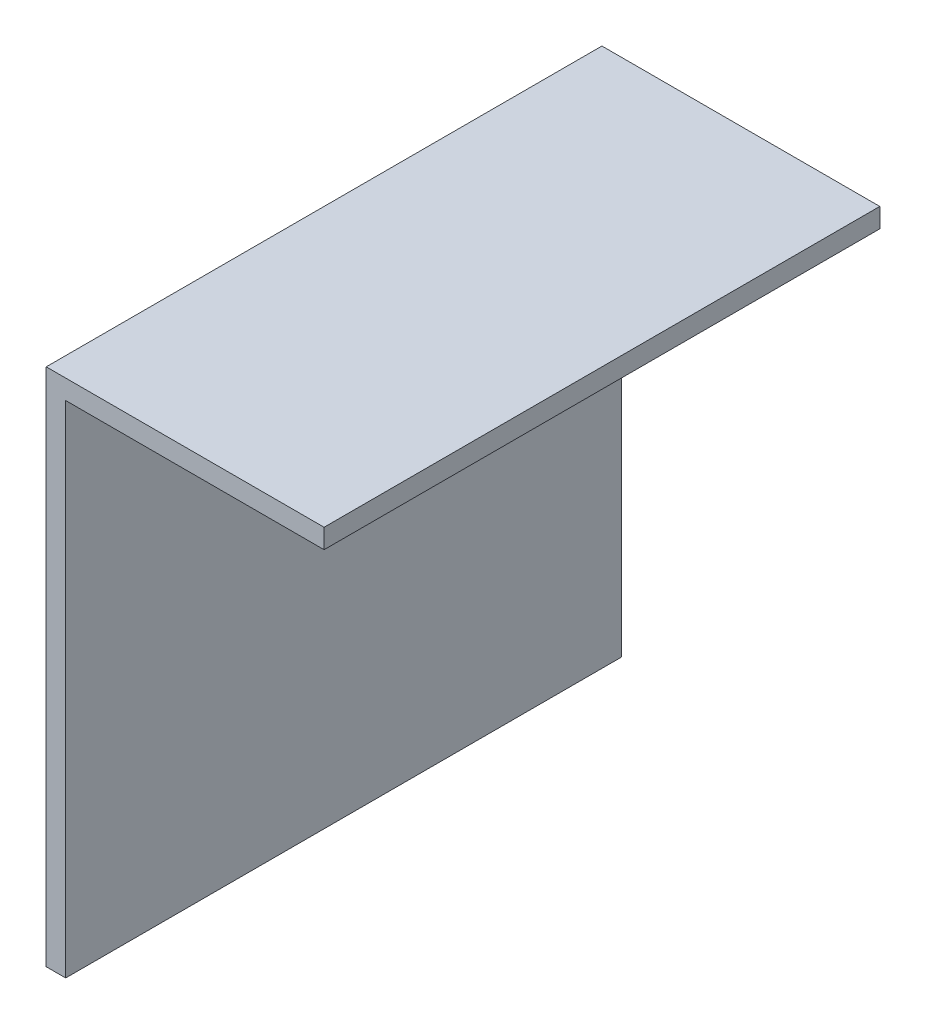
ISO-10303-21;
HEADER;
FILE_DESCRIPTION(('STEP AP214'),'2;1');
FILE_NAME('part.step','',(''),(''),'','','');
FILE_SCHEMA(('AUTOMOTIVE_DESIGN { 1 0 10303 214 1 1 1 1 }'));
ENDSEC;
DATA;
#1=APPLICATION_CONTEXT('core data for automotive mechanical design processes');
#2=APPLICATION_PROTOCOL_DEFINITION('international standard','automotive_design',2000,#1);
#3=PRODUCT_CONTEXT('',#1,'mechanical');
#4=PRODUCT('Part','Part','',(#3));
#5=PRODUCT_RELATED_PRODUCT_CATEGORY('part','',(#4));
#6=PRODUCT_DEFINITION_FORMATION('','',#4);
#7=PRODUCT_DEFINITION_CONTEXT('part definition',#1,'design');
#8=PRODUCT_DEFINITION('design','',#6,#7);
#9=PRODUCT_DEFINITION_SHAPE('','',#8);
#10=(LENGTH_UNIT() NAMED_UNIT(*) SI_UNIT(.MILLI.,.METRE.));
#11=(NAMED_UNIT(*) PLANE_ANGLE_UNIT() SI_UNIT($,.RADIAN.));
#12=(NAMED_UNIT(*) SI_UNIT($,.STERADIAN.) SOLID_ANGLE_UNIT());
#13=UNCERTAINTY_MEASURE_WITH_UNIT(LENGTH_MEASURE(1.E-05),#10,'distance_accuracy_value','');
#14=(GEOMETRIC_REPRESENTATION_CONTEXT(3) GLOBAL_UNCERTAINTY_ASSIGNED_CONTEXT((#13)) GLOBAL_UNIT_ASSIGNED_CONTEXT((#10,
#11,#12)) REPRESENTATION_CONTEXT('',''));
#15=CARTESIAN_POINT('',(0.,0.,0.));
#16=DIRECTION('',(0.,0.,1.));
#17=DIRECTION('',(1.,0.,0.));
#18=AXIS2_PLACEMENT_3D('',#15,#16,#17);
#19=CARTESIAN_POINT('',(500.,70.,1000.));
#20=DIRECTION('',(-1.,0.,0.));
#21=DIRECTION('',(0.,0.,1.));
#22=AXIS2_PLACEMENT_3D('',#19,#20,#21);
#23=PLANE('',#22);
#24=DIRECTION('',(0.,0.,-1.));
#25=VECTOR('',#24,1.);
#26=CARTESIAN_POINT('',(500.,0.,1000.));
#27=LINE('',#26,#25);
#28=CARTESIAN_POINT('',(500.,0.,1000.));
#29=VERTEX_POINT('',#28);
#30=CARTESIAN_POINT('',(500.,0.,-1000.));
#31=VERTEX_POINT('',#30);
#32=EDGE_CURVE('E102',#29,#31,#27,.T.);
#33=ORIENTED_EDGE('',*,*,#32,.T.);
#34=DIRECTION('',(0.,-1.,0.));
#35=VECTOR('',#34,1.);
#36=CARTESIAN_POINT('',(500.,70.,-1000.));
#37=LINE('',#36,#35);
#38=CARTESIAN_POINT('',(500.,70.,-1000.));
#39=VERTEX_POINT('',#38);
#40=EDGE_CURVE('E24',#39,#31,#37,.T.);
#41=ORIENTED_EDGE('',*,*,#40,.F.);
#42=DIRECTION('',(0.,0.,-1.));
#43=VECTOR('',#42,1.);
#44=CARTESIAN_POINT('',(500.,70.,1000.));
#45=LINE('',#44,#43);
#46=CARTESIAN_POINT('',(500.,70.,1000.));
#47=VERTEX_POINT('',#46);
#48=EDGE_CURVE('E104',#47,#39,#45,.T.);
#49=ORIENTED_EDGE('',*,*,#48,.F.);
#50=DIRECTION('',(0.,-1.,0.));
#51=VECTOR('',#50,1.);
#52=CARTESIAN_POINT('',(500.,70.,1000.));
#53=LINE('',#52,#51);
#54=EDGE_CURVE('E82',#47,#29,#53,.T.);
#55=ORIENTED_EDGE('',*,*,#54,.T.);
#56=EDGE_LOOP('',(#33,#41,#49,#55));
#57=FACE_BOUND('',#56,.T.);
#58=ADVANCED_FACE('F17',(#57),#23,.F.);
#59=CARTESIAN_POINT('',(-500.,70.,-1000.));
#60=DIRECTION('',(0.,0.,1.));
#61=DIRECTION('',(1.,0.,0.));
#62=AXIS2_PLACEMENT_3D('',#59,#60,#61);
#63=PLANE('',#62);
#64=DIRECTION('',(-1.,0.,0.));
#65=VECTOR('',#64,1.);
#66=CARTESIAN_POINT('',(-500.,0.,-1000.));
#67=LINE('',#66,#65);
#68=CARTESIAN_POINT('',(-430.,-4.44089209850063E-13,-1000.));
#69=VERTEX_POINT('',#68);
#70=EDGE_CURVE('E112',#31,#69,#67,.T.);
#71=ORIENTED_EDGE('',*,*,#70,.T.);
#72=DIRECTION('',(0.,1.,0.));
#73=VECTOR('',#72,1.);
#74=CARTESIAN_POINT('',(-430.,-1800.,-1000.));
#75=LINE('',#74,#73);
#76=CARTESIAN_POINT('',(-430.,-1800.,-1000.));
#77=VERTEX_POINT('',#76);
#78=EDGE_CURVE('E100',#77,#69,#75,.T.);
#79=ORIENTED_EDGE('',*,*,#78,.F.);
#80=DIRECTION('',(-1.,0.,0.));
#81=VECTOR('',#80,1.);
#82=CARTESIAN_POINT('',(-500.,-1800.,-1000.));
#83=LINE('',#82,#81);
#84=CARTESIAN_POINT('',(-500.,-1800.,-1000.));
#85=VERTEX_POINT('',#84);
#86=EDGE_CURVE('E98',#77,#85,#83,.T.);
#87=ORIENTED_EDGE('',*,*,#86,.T.);
#88=DIRECTION('',(0.,-1.,0.));
#89=VECTOR('',#88,1.);
#90=CARTESIAN_POINT('',(-500.,70.,-1000.));
#91=LINE('',#90,#89);
#92=CARTESIAN_POINT('',(-500.,70.,-1000.));
#93=VERTEX_POINT('',#92);
#94=EDGE_CURVE('E81',#93,#85,#91,.T.);
#95=ORIENTED_EDGE('',*,*,#94,.F.);
#96=DIRECTION('',(-1.,0.,0.));
#97=VECTOR('',#96,1.);
#98=CARTESIAN_POINT('',(-500.,70.,-1000.));
#99=LINE('',#98,#97);
#100=EDGE_CURVE('E59',#39,#93,#99,.T.);
#101=ORIENTED_EDGE('',*,*,#100,.F.);
#102=ORIENTED_EDGE('',*,*,#40,.T.);
#103=EDGE_LOOP('',(#71,#79,#87,#95,#101,#102));
#104=FACE_BOUND('',#103,.T.);
#105=ADVANCED_FACE('F118',(#104),#63,.F.);
#106=CARTESIAN_POINT('',(-500.,70.,1000.));
#107=DIRECTION('',(1.,0.,0.));
#108=DIRECTION('',(0.,0.,-1.));
#109=AXIS2_PLACEMENT_3D('',#106,#107,#108);
#110=PLANE('',#109);
#111=ORIENTED_EDGE('',*,*,#94,.T.);
#112=DIRECTION('',(0.,0.,1.));
#113=VECTOR('',#112,1.);
#114=CARTESIAN_POINT('',(-500.,-1800.,-1000.));
#115=LINE('',#114,#113);
#116=CARTESIAN_POINT('',(-500.,-1800.,1000.));
#117=VERTEX_POINT('',#116);
#118=EDGE_CURVE('E89',#85,#117,#115,.T.);
#119=ORIENTED_EDGE('',*,*,#118,.T.);
#120=DIRECTION('',(0.,-1.,0.));
#121=VECTOR('',#120,1.);
#122=CARTESIAN_POINT('',(-500.,70.,1000.));
#123=LINE('',#122,#121);
#124=CARTESIAN_POINT('',(-500.,70.,1000.));
#125=VERTEX_POINT('',#124);
#126=EDGE_CURVE('E74',#125,#117,#123,.T.);
#127=ORIENTED_EDGE('',*,*,#126,.F.);
#128=DIRECTION('',(0.,0.,1.));
#129=VECTOR('',#128,1.);
#130=CARTESIAN_POINT('',(-500.,70.,1000.));
#131=LINE('',#130,#129);
#132=EDGE_CURVE('E107',#93,#125,#131,.T.);
#133=ORIENTED_EDGE('',*,*,#132,.F.);
#134=EDGE_LOOP('',(#111,#119,#127,#133));
#135=FACE_BOUND('',#134,.T.);
#136=ADVANCED_FACE('F94',(#135),#110,.F.);
#137=CARTESIAN_POINT('',(-500.,70.,1000.));
#138=DIRECTION('',(0.,0.,-1.));
#139=DIRECTION('',(-1.,0.,0.));
#140=AXIS2_PLACEMENT_3D('',#137,#138,#139);
#141=PLANE('',#140);
#142=ORIENTED_EDGE('',*,*,#54,.F.);
#143=DIRECTION('',(1.,0.,0.));
#144=VECTOR('',#143,1.);
#145=CARTESIAN_POINT('',(-500.,70.,1000.));
#146=LINE('',#145,#144);
#147=EDGE_CURVE('E39',#125,#47,#146,.T.);
#148=ORIENTED_EDGE('',*,*,#147,.F.);
#149=ORIENTED_EDGE('',*,*,#126,.T.);
#150=DIRECTION('',(1.,0.,0.));
#151=VECTOR('',#150,1.);
#152=CARTESIAN_POINT('',(-500.,-1800.,1000.));
#153=LINE('',#152,#151);
#154=CARTESIAN_POINT('',(-430.,-1800.,1000.));
#155=VERTEX_POINT('',#154);
#156=EDGE_CURVE('E77',#117,#155,#153,.T.);
#157=ORIENTED_EDGE('',*,*,#156,.T.);
#158=DIRECTION('',(0.,1.,0.));
#159=VECTOR('',#158,1.);
#160=CARTESIAN_POINT('',(-430.,-1800.,1000.));
#161=LINE('',#160,#159);
#162=CARTESIAN_POINT('',(-430.,0.,1000.));
#163=VERTEX_POINT('',#162);
#164=EDGE_CURVE('E31',#155,#163,#161,.T.);
#165=ORIENTED_EDGE('',*,*,#164,.T.);
#166=DIRECTION('',(1.,0.,0.));
#167=VECTOR('',#166,1.);
#168=CARTESIAN_POINT('',(-500.,0.,1000.));
#169=LINE('',#168,#167);
#170=EDGE_CURVE('E51',#163,#29,#169,.T.);
#171=ORIENTED_EDGE('',*,*,#170,.T.);
#172=EDGE_LOOP('',(#142,#148,#149,#157,#165,#171));
#173=FACE_BOUND('',#172,.T.);
#174=ADVANCED_FACE('F76',(#173),#141,.F.);
#175=CARTESIAN_POINT('',(0.,70.,0.));
#176=DIRECTION('',(0.,-1.,0.));
#177=DIRECTION('',(0.,0.,-1.));
#178=AXIS2_PLACEMENT_3D('',#175,#176,#177);
#179=PLANE('',#178);
#180=ORIENTED_EDGE('',*,*,#100,.T.);
#181=ORIENTED_EDGE('',*,*,#132,.T.);
#182=ORIENTED_EDGE('',*,*,#147,.T.);
#183=ORIENTED_EDGE('',*,*,#48,.T.);
#184=EDGE_LOOP('',(#180,#181,#182,#183));
#185=FACE_BOUND('',#184,.T.);
#186=ADVANCED_FACE('F127',(#185),#179,.F.);
#187=CARTESIAN_POINT('',(0.,0.,0.));
#188=DIRECTION('',(0.,-1.,0.));
#189=DIRECTION('',(0.,0.,-1.));
#190=AXIS2_PLACEMENT_3D('',#187,#188,#189);
#191=PLANE('',#190);
#192=DIRECTION('',(0.,0.,1.));
#193=VECTOR('',#192,1.);
#194=CARTESIAN_POINT('',(-430.,0.,0.));
#195=LINE('',#194,#193);
#196=EDGE_CURVE('E11',#69,#163,#195,.T.);
#197=ORIENTED_EDGE('',*,*,#196,.F.);
#198=ORIENTED_EDGE('',*,*,#70,.F.);
#199=ORIENTED_EDGE('',*,*,#32,.F.);
#200=ORIENTED_EDGE('',*,*,#170,.F.);
#201=EDGE_LOOP('',(#197,#198,#199,#200));
#202=FACE_BOUND('',#201,.T.);
#203=ADVANCED_FACE('F124',(#202),#191,.T.);
#204=CARTESIAN_POINT('',(-430.,-1800.,-1000.));
#205=DIRECTION('',(1.,0.,0.));
#206=DIRECTION('',(0.,0.,-1.));
#207=AXIS2_PLACEMENT_3D('',#204,#205,#206);
#208=PLANE('',#207);
#209=ORIENTED_EDGE('',*,*,#78,.T.);
#210=ORIENTED_EDGE('',*,*,#196,.T.);
#211=ORIENTED_EDGE('',*,*,#164,.F.);
#212=DIRECTION('',(0.,0.,-1.));
#213=VECTOR('',#212,1.);
#214=CARTESIAN_POINT('',(-430.,-1800.,-1000.));
#215=LINE('',#214,#213);
#216=EDGE_CURVE('E92',#155,#77,#215,.T.);
#217=ORIENTED_EDGE('',*,*,#216,.T.);
#218=EDGE_LOOP('',(#209,#210,#211,#217));
#219=FACE_BOUND('',#218,.T.);
#220=ADVANCED_FACE('F126',(#219),#208,.T.);
#221=CARTESIAN_POINT('',(0.,-1800.,0.));
#222=DIRECTION('',(0.,1.,0.));
#223=DIRECTION('',(0.,0.,1.));
#224=AXIS2_PLACEMENT_3D('',#221,#222,#223);
#225=PLANE('',#224);
#226=ORIENTED_EDGE('',*,*,#118,.F.);
#227=ORIENTED_EDGE('',*,*,#86,.F.);
#228=ORIENTED_EDGE('',*,*,#216,.F.);
#229=ORIENTED_EDGE('',*,*,#156,.F.);
#230=EDGE_LOOP('',(#226,#227,#228,#229));
#231=FACE_BOUND('',#230,.T.);
#232=ADVANCED_FACE('F87',(#231),#225,.F.);
#233=CLOSED_SHELL('',(#58,#105,#136,#174,#186,#203,#220,#232));
#234=MANIFOLD_SOLID_BREP('B1',#233);
#235=ADVANCED_BREP_SHAPE_REPRESENTATION('',(#18,#234),#14);
#236=SHAPE_DEFINITION_REPRESENTATION(#9,#235);
ENDSEC;
END-ISO-10303-21;
